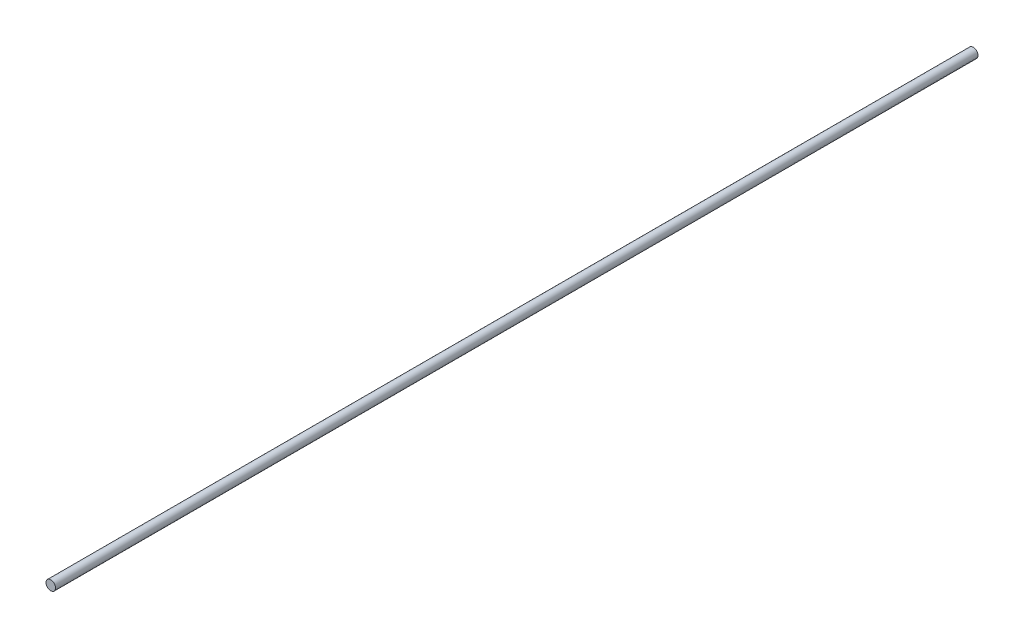
ISO-10303-21;
HEADER;
FILE_DESCRIPTION(('STEP AP214'),'2;1');
FILE_NAME('part.step','',(''),(''),'','','');
FILE_SCHEMA(('AUTOMOTIVE_DESIGN { 1 0 10303 214 1 1 1 1 }'));
ENDSEC;
DATA;
#1=APPLICATION_CONTEXT('core data for automotive mechanical design processes');
#2=APPLICATION_PROTOCOL_DEFINITION('international standard','automotive_design',2000,#1);
#3=PRODUCT_CONTEXT('',#1,'mechanical');
#4=PRODUCT('Part','Part','',(#3));
#5=PRODUCT_RELATED_PRODUCT_CATEGORY('part','',(#4));
#6=PRODUCT_DEFINITION_FORMATION('','',#4);
#7=PRODUCT_DEFINITION_CONTEXT('part definition',#1,'design');
#8=PRODUCT_DEFINITION('design','',#6,#7);
#9=PRODUCT_DEFINITION_SHAPE('','',#8);
#10=(LENGTH_UNIT() NAMED_UNIT(*) SI_UNIT(.MILLI.,.METRE.));
#11=(NAMED_UNIT(*) PLANE_ANGLE_UNIT() SI_UNIT($,.RADIAN.));
#12=(NAMED_UNIT(*) SI_UNIT($,.STERADIAN.) SOLID_ANGLE_UNIT());
#13=UNCERTAINTY_MEASURE_WITH_UNIT(LENGTH_MEASURE(1.E-05),#10,'distance_accuracy_value','');
#14=(GEOMETRIC_REPRESENTATION_CONTEXT(3) GLOBAL_UNCERTAINTY_ASSIGNED_CONTEXT((#13)) GLOBAL_UNIT_ASSIGNED_CONTEXT((#10,
#11,#12)) REPRESENTATION_CONTEXT('',''));
#15=CARTESIAN_POINT('',(0.,0.,0.));
#16=DIRECTION('',(0.,0.,1.));
#17=DIRECTION('',(1.,0.,0.));
#18=AXIS2_PLACEMENT_3D('',#15,#16,#17);
#19=CARTESIAN_POINT('',(0.,0.,77.3771343474792));
#20=DIRECTION('',(0.,0.,-1.));
#21=DIRECTION('',(-1.,0.,0.));
#22=AXIS2_PLACEMENT_3D('',#19,#20,#21);
#23=CYLINDRICAL_SURFACE('',#22,0.4);
#24=CARTESIAN_POINT('',(0.,0.,77.3771343474792));
#25=DIRECTION('',(0.,0.,1.));
#26=DIRECTION('',(1.,0.,0.));
#27=AXIS2_PLACEMENT_3D('',#24,#25,#26);
#28=CIRCLE('',#27,0.4);
#29=CARTESIAN_POINT('',(0.4,0.,77.3771343474792));
#30=VERTEX_POINT('',#29);
#31=EDGE_CURVE('E10',#30,#30,#28,.T.);
#32=ORIENTED_EDGE('',*,*,#31,.F.);
#33=EDGE_LOOP('',(#32));
#34=FACE_BOUND('',#33,.T.);
#35=CARTESIAN_POINT('',(0.,0.,0.));
#36=DIRECTION('',(0.,0.,1.));
#37=DIRECTION('',(1.,0.,0.));
#38=AXIS2_PLACEMENT_3D('',#35,#36,#37);
#39=CIRCLE('',#38,0.4);
#40=CARTESIAN_POINT('',(0.4,0.,0.));
#41=VERTEX_POINT('',#40);
#42=EDGE_CURVE('E40',#41,#41,#39,.T.);
#43=ORIENTED_EDGE('',*,*,#42,.T.);
#44=EDGE_LOOP('',(#43));
#45=FACE_BOUND('',#44,.T.);
#46=ADVANCED_FACE('F37',(#34,#45),#23,.T.);
#47=CARTESIAN_POINT('',(0.,0.,77.3771343474792));
#48=DIRECTION('',(0.,0.,1.));
#49=DIRECTION('',(1.,0.,0.));
#50=AXIS2_PLACEMENT_3D('',#47,#48,#49);
#51=PLANE('',#50);
#52=ORIENTED_EDGE('',*,*,#31,.T.);
#53=EDGE_LOOP('',(#52));
#54=FACE_BOUND('',#53,.T.);
#55=ADVANCED_FACE('F52',(#54),#51,.T.);
#56=CARTESIAN_POINT('',(0.,0.,0.));
#57=DIRECTION('',(0.,0.,1.));
#58=DIRECTION('',(1.,0.,0.));
#59=AXIS2_PLACEMENT_3D('',#56,#57,#58);
#60=PLANE('',#59);
#61=ORIENTED_EDGE('',*,*,#42,.F.);
#62=EDGE_LOOP('',(#61));
#63=FACE_BOUND('',#62,.T.);
#64=ADVANCED_FACE('F50',(#63),#60,.F.);
#65=CLOSED_SHELL('',(#46,#55,#64));
#66=MANIFOLD_SOLID_BREP('B2',#65);
#67=ADVANCED_BREP_SHAPE_REPRESENTATION('',(#18,#66),#14);
#68=SHAPE_DEFINITION_REPRESENTATION(#9,#67);
ENDSEC;
END-ISO-10303-21;
